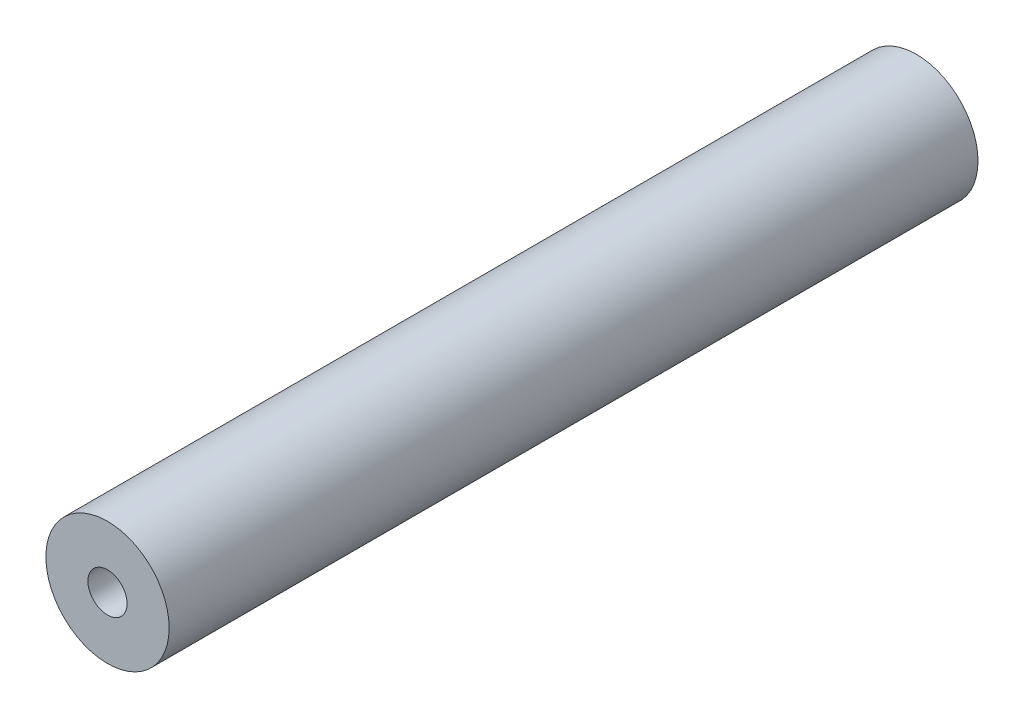
ISO-10303-21;
HEADER;
FILE_DESCRIPTION(('STEP AP214'),'2;1');
FILE_NAME('part.step','',(''),(''),'','','');
FILE_SCHEMA(('AUTOMOTIVE_DESIGN { 1 0 10303 214 1 1 1 1 }'));
ENDSEC;
DATA;
#1=APPLICATION_CONTEXT('core data for automotive mechanical design processes');
#2=APPLICATION_PROTOCOL_DEFINITION('international standard','automotive_design',2000,#1);
#3=PRODUCT_CONTEXT('',#1,'mechanical');
#4=PRODUCT('Part','Part','',(#3));
#5=PRODUCT_RELATED_PRODUCT_CATEGORY('part','',(#4));
#6=PRODUCT_DEFINITION_FORMATION('','',#4);
#7=PRODUCT_DEFINITION_CONTEXT('part definition',#1,'design');
#8=PRODUCT_DEFINITION('design','',#6,#7);
#9=PRODUCT_DEFINITION_SHAPE('','',#8);
#10=(LENGTH_UNIT() NAMED_UNIT(*) SI_UNIT(.MILLI.,.METRE.));
#11=(NAMED_UNIT(*) PLANE_ANGLE_UNIT() SI_UNIT($,.RADIAN.));
#12=(NAMED_UNIT(*) SI_UNIT($,.STERADIAN.) SOLID_ANGLE_UNIT());
#13=UNCERTAINTY_MEASURE_WITH_UNIT(LENGTH_MEASURE(1.E-05),#10,'distance_accuracy_value','');
#14=(GEOMETRIC_REPRESENTATION_CONTEXT(3) GLOBAL_UNCERTAINTY_ASSIGNED_CONTEXT((#13)) GLOBAL_UNIT_ASSIGNED_CONTEXT((#10,
#11,#12)) REPRESENTATION_CONTEXT('',''));
#15=CARTESIAN_POINT('',(0.,0.,0.));
#16=DIRECTION('',(0.,0.,1.));
#17=DIRECTION('',(1.,0.,0.));
#18=AXIS2_PLACEMENT_3D('',#15,#16,#17);
#19=CARTESIAN_POINT('',(0.,0.,41.67251));
#20=DIRECTION('',(0.,0.,-1.));
#21=DIRECTION('',(-1.,0.,0.));
#22=AXIS2_PLACEMENT_3D('',#19,#20,#21);
#23=CYLINDRICAL_SURFACE('',#22,6.35);
#24=CARTESIAN_POINT('',(0.,0.,41.67251));
#25=DIRECTION('',(0.,0.,1.));
#26=DIRECTION('',(1.,0.,0.));
#27=AXIS2_PLACEMENT_3D('',#24,#25,#26);
#28=CIRCLE('',#27,6.35);
#29=CARTESIAN_POINT('',(6.35,0.,41.67251));
#30=VERTEX_POINT('',#29);
#31=EDGE_CURVE('E11',#30,#30,#28,.T.);
#32=ORIENTED_EDGE('',*,*,#31,.F.);
#33=EDGE_LOOP('',(#32));
#34=FACE_BOUND('',#33,.T.);
#35=CARTESIAN_POINT('',(0.,0.,-41.67251));
#36=DIRECTION('',(0.,0.,1.));
#37=DIRECTION('',(1.,0.,0.));
#38=AXIS2_PLACEMENT_3D('',#35,#36,#37);
#39=CIRCLE('',#38,6.35);
#40=CARTESIAN_POINT('',(6.35,0.,-41.67251));
#41=VERTEX_POINT('',#40);
#42=EDGE_CURVE('E56',#41,#41,#39,.T.);
#43=ORIENTED_EDGE('',*,*,#42,.T.);
#44=EDGE_LOOP('',(#43));
#45=FACE_BOUND('',#44,.T.);
#46=ADVANCED_FACE('F53',(#34,#45),#23,.T.);
#47=CARTESIAN_POINT('',(0.,0.,41.67251));
#48=DIRECTION('',(0.,0.,1.));
#49=DIRECTION('',(1.,0.,0.));
#50=AXIS2_PLACEMENT_3D('',#47,#48,#49);
#51=PLANE('',#50);
#52=CARTESIAN_POINT('',(0.,0.,41.67251));
#53=DIRECTION('',(0.,0.,1.));
#54=DIRECTION('',(1.,0.,0.));
#55=AXIS2_PLACEMENT_3D('',#52,#53,#54);
#56=CIRCLE('',#55,2.01929999999999);
#57=CARTESIAN_POINT('',(2.01929999999999,0.,41.67251));
#58=VERTEX_POINT('',#57);
#59=EDGE_CURVE('E76',#58,#58,#56,.T.);
#60=ORIENTED_EDGE('',*,*,#59,.F.);
#61=EDGE_LOOP('',(#60));
#62=FACE_BOUND('',#61,.T.);
#63=ORIENTED_EDGE('',*,*,#31,.T.);
#64=EDGE_LOOP('',(#63));
#65=FACE_BOUND('',#64,.T.);
#66=ADVANCED_FACE('F95',(#62,#65),#51,.T.);
#67=CARTESIAN_POINT('',(0.,0.,-41.67251));
#68=DIRECTION('',(0.,0.,1.));
#69=DIRECTION('',(1.,0.,0.));
#70=AXIS2_PLACEMENT_3D('',#67,#68,#69);
#71=PLANE('',#70);
#72=CARTESIAN_POINT('',(0.,0.,-41.67251));
#73=DIRECTION('',(0.,0.,-1.));
#74=DIRECTION('',(-1.,0.,0.));
#75=AXIS2_PLACEMENT_3D('',#72,#73,#74);
#76=CIRCLE('',#75,2.01929999999999);
#77=CARTESIAN_POINT('',(-2.01929999999999,0.,-41.67251));
#78=VERTEX_POINT('',#77);
#79=EDGE_CURVE('E77',#78,#78,#76,.T.);
#80=ORIENTED_EDGE('',*,*,#79,.F.);
#81=EDGE_LOOP('',(#80));
#82=FACE_BOUND('',#81,.T.);
#83=ORIENTED_EDGE('',*,*,#42,.F.);
#84=EDGE_LOOP('',(#83));
#85=FACE_BOUND('',#84,.T.);
#86=ADVANCED_FACE('F92',(#82,#85),#71,.F.);
#87=CARTESIAN_POINT('',(0.,0.,29.64307));
#88=DIRECTION('',(0.,0.,1.));
#89=DIRECTION('',(1.,0.,0.));
#90=AXIS2_PLACEMENT_3D('',#87,#88,#89);
#91=CONICAL_SURFACE('',#90,2.01929999999999,1.02974425867665);
#92=CARTESIAN_POINT('',(0.,0.,28.4297521519976));
#93=VERTEX_POINT('',#92);
#94=VERTEX_LOOP('',#93);
#95=FACE_BOUND('',#94,.T.);
#96=CARTESIAN_POINT('',(0.,0.,29.64307));
#97=DIRECTION('',(0.,0.,1.));
#98=DIRECTION('',(1.,0.,0.));
#99=AXIS2_PLACEMENT_3D('',#96,#97,#98);
#100=CIRCLE('',#99,2.01929999999999);
#101=CARTESIAN_POINT('',(2.01929999999999,0.,29.64307));
#102=VERTEX_POINT('',#101);
#103=EDGE_CURVE('E80',#102,#102,#100,.T.);
#104=ORIENTED_EDGE('',*,*,#103,.T.);
#105=EDGE_LOOP('',(#104));
#106=FACE_BOUND('',#105,.T.);
#107=ADVANCED_FACE('F94',(#95,#106),#91,.F.);
#108=CARTESIAN_POINT('',(0.,0.,41.67251));
#109=DIRECTION('',(0.,0.,1.));
#110=DIRECTION('',(1.,0.,0.));
#111=AXIS2_PLACEMENT_3D('',#108,#109,#110);
#112=CYLINDRICAL_SURFACE('',#111,2.01929999999999);
#113=ORIENTED_EDGE('',*,*,#103,.F.);
#114=EDGE_LOOP('',(#113));
#115=FACE_BOUND('',#114,.T.);
#116=ORIENTED_EDGE('',*,*,#59,.T.);
#117=EDGE_LOOP('',(#116));
#118=FACE_BOUND('',#117,.T.);
#119=ADVANCED_FACE('F70',(#115,#118),#112,.F.);
#120=CARTESIAN_POINT('',(0.,0.,-29.64307));
#121=DIRECTION('',(0.,0.,-1.));
#122=DIRECTION('',(-1.,0.,0.));
#123=AXIS2_PLACEMENT_3D('',#120,#121,#122);
#124=CONICAL_SURFACE('',#123,2.01929999999999,1.02974425867665);
#125=CARTESIAN_POINT('',(0.,0.,-28.4297521519976));
#126=VERTEX_POINT('',#125);
#127=VERTEX_LOOP('',#126);
#128=FACE_BOUND('',#127,.T.);
#129=CARTESIAN_POINT('',(0.,0.,-29.64307));
#130=DIRECTION('',(0.,0.,-1.));
#131=DIRECTION('',(-1.,0.,0.));
#132=AXIS2_PLACEMENT_3D('',#129,#130,#131);
#133=CIRCLE('',#132,2.01929999999999);
#134=CARTESIAN_POINT('',(-2.01929999999999,0.,-29.64307));
#135=VERTEX_POINT('',#134);
#136=EDGE_CURVE('E74',#135,#135,#133,.T.);
#137=ORIENTED_EDGE('',*,*,#136,.T.);
#138=EDGE_LOOP('',(#137));
#139=FACE_BOUND('',#138,.T.);
#140=ADVANCED_FACE('F66',(#128,#139),#124,.F.);
#141=CARTESIAN_POINT('',(0.,0.,-41.67251));
#142=DIRECTION('',(0.,0.,-1.));
#143=DIRECTION('',(-1.,0.,0.));
#144=AXIS2_PLACEMENT_3D('',#141,#142,#143);
#145=CYLINDRICAL_SURFACE('',#144,2.01929999999999);
#146=ORIENTED_EDGE('',*,*,#136,.F.);
#147=EDGE_LOOP('',(#146));
#148=FACE_BOUND('',#147,.T.);
#149=ORIENTED_EDGE('',*,*,#79,.T.);
#150=EDGE_LOOP('',(#149));
#151=FACE_BOUND('',#150,.T.);
#152=ADVANCED_FACE('F69',(#148,#151),#145,.F.);
#153=CLOSED_SHELL('',(#46,#66,#86,#107,#119,#140,#152));
#154=MANIFOLD_SOLID_BREP('B2',#153);
#155=ADVANCED_BREP_SHAPE_REPRESENTATION('',(#18,#154),#14);
#156=SHAPE_DEFINITION_REPRESENTATION(#9,#155);
ENDSEC;
END-ISO-10303-21;
